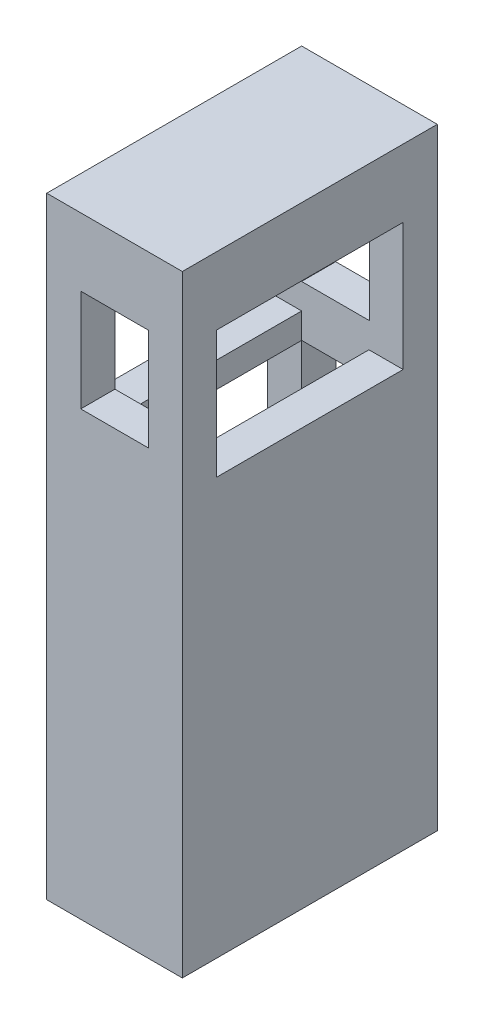
ISO-10303-21;
HEADER;
FILE_DESCRIPTION(('STEP AP214'),'2;1');
FILE_NAME('part.step','',(''),(''),'','','');
FILE_SCHEMA(('AUTOMOTIVE_DESIGN { 1 0 10303 214 1 1 1 1 }'));
ENDSEC;
DATA;
#1=APPLICATION_CONTEXT('core data for automotive mechanical design processes');
#2=APPLICATION_PROTOCOL_DEFINITION('international standard','automotive_design',2000,#1);
#3=PRODUCT_CONTEXT('',#1,'mechanical');
#4=PRODUCT('Part','Part','',(#3));
#5=PRODUCT_RELATED_PRODUCT_CATEGORY('part','',(#4));
#6=PRODUCT_DEFINITION_FORMATION('','',#4);
#7=PRODUCT_DEFINITION_CONTEXT('part definition',#1,'design');
#8=PRODUCT_DEFINITION('design','',#6,#7);
#9=PRODUCT_DEFINITION_SHAPE('','',#8);
#10=(LENGTH_UNIT() NAMED_UNIT(*) SI_UNIT(.MILLI.,.METRE.));
#11=(NAMED_UNIT(*) PLANE_ANGLE_UNIT() SI_UNIT($,.RADIAN.));
#12=(NAMED_UNIT(*) SI_UNIT($,.STERADIAN.) SOLID_ANGLE_UNIT());
#13=UNCERTAINTY_MEASURE_WITH_UNIT(LENGTH_MEASURE(1.E-05),#10,'distance_accuracy_value','');
#14=(GEOMETRIC_REPRESENTATION_CONTEXT(3) GLOBAL_UNCERTAINTY_ASSIGNED_CONTEXT((#13)) GLOBAL_UNIT_ASSIGNED_CONTEXT((#10,
#11,#12)) REPRESENTATION_CONTEXT('',''));
#15=CARTESIAN_POINT('',(0.,0.,0.));
#16=DIRECTION('',(0.,0.,1.));
#17=DIRECTION('',(1.,0.,0.));
#18=AXIS2_PLACEMENT_3D('',#15,#16,#17);
#19=CARTESIAN_POINT('',(667.5,10670.,0.));
#20=DIRECTION('',(0.,1.,0.));
#21=DIRECTION('',(0.,0.,1.));
#22=AXIS2_PLACEMENT_3D('',#19,#20,#21);
#23=PLANE('',#22);
#24=DIRECTION('',(1.,0.,0.));
#25=VECTOR('',#24,1.);
#26=CARTESIAN_POINT('',(0.,10670.,670.000000000001));
#27=LINE('',#26,#25);
#28=CARTESIAN_POINT('',(0.,10670.,670.000000000001));
#29=VERTEX_POINT('',#28);
#30=CARTESIAN_POINT('',(200.,10670.,670.000000000001));
#31=VERTEX_POINT('',#30);
#32=EDGE_CURVE('E403',#29,#31,#27,.T.);
#33=ORIENTED_EDGE('',*,*,#32,.T.);
#34=DIRECTION('',(0.,0.,-1.));
#35=VECTOR('',#34,1.);
#36=CARTESIAN_POINT('',(200.,10670.,4330.));
#37=LINE('',#36,#35);
#38=CARTESIAN_POINT('',(200.,10670.,4330.));
#39=VERTEX_POINT('',#38);
#40=EDGE_CURVE('E281',#39,#31,#37,.T.);
#41=ORIENTED_EDGE('',*,*,#40,.F.);
#42=DIRECTION('',(1.,0.,0.));
#43=VECTOR('',#42,1.);
#44=CARTESIAN_POINT('',(0.,10670.,4330.));
#45=LINE('',#44,#43);
#46=CARTESIAN_POINT('',(0.,10670.,4330.));
#47=VERTEX_POINT('',#46);
#48=EDGE_CURVE('E399',#47,#39,#45,.T.);
#49=ORIENTED_EDGE('',*,*,#48,.F.);
#50=DIRECTION('',(0.,0.,-1.));
#51=VECTOR('',#50,1.);
#52=CARTESIAN_POINT('',(0.,10670.,4330.));
#53=LINE('',#52,#51);
#54=EDGE_CURVE('E377',#47,#29,#53,.T.);
#55=ORIENTED_EDGE('',*,*,#54,.T.);
#56=EDGE_LOOP('',(#33,#41,#49,#55));
#57=FACE_BOUND('',#56,.T.);
#58=ADVANCED_FACE('F34',(#57),#23,.F.);
#59=DIRECTION('',(0.,0.,1.));
#60=VECTOR('',#59,1.);
#61=CARTESIAN_POINT('',(667.5,10670.,0.));
#62=LINE('',#61,#60);
#63=CARTESIAN_POINT('',(667.5,10670.,4330.));
#64=VERTEX_POINT('',#63);
#65=CARTESIAN_POINT('',(667.5,10670.,5000.));
#66=VERTEX_POINT('',#65);
#67=EDGE_CURVE('E449',#64,#66,#62,.T.);
#68=ORIENTED_EDGE('',*,*,#67,.F.);
#69=DIRECTION('',(-1.,0.,0.));
#70=VECTOR('',#69,1.);
#71=CARTESIAN_POINT('',(200.,10670.,4330.));
#72=LINE('',#71,#70);
#73=CARTESIAN_POINT('',(1997.5,10670.,4330.));
#74=VERTEX_POINT('',#73);
#75=EDGE_CURVE('E289',#74,#64,#72,.T.);
#76=ORIENTED_EDGE('',*,*,#75,.F.);
#77=DIRECTION('',(0.,0.,1.));
#78=VECTOR('',#77,1.);
#79=CARTESIAN_POINT('',(1997.5,10670.,0.));
#80=LINE('',#79,#78);
#81=CARTESIAN_POINT('',(1997.5,10670.,5000.));
#82=VERTEX_POINT('',#81);
#83=EDGE_CURVE('E453',#74,#82,#80,.T.);
#84=ORIENTED_EDGE('',*,*,#83,.T.);
#85=DIRECTION('',(-1.,0.,0.));
#86=VECTOR('',#85,1.);
#87=CARTESIAN_POINT('',(667.5,10670.,5000.));
#88=LINE('',#87,#86);
#89=EDGE_CURVE('E425',#82,#66,#88,.T.);
#90=ORIENTED_EDGE('',*,*,#89,.T.);
#91=EDGE_LOOP('',(#68,#76,#84,#90));
#92=FACE_BOUND('',#91,.T.);
#93=ADVANCED_FACE('F514',(#92),#23,.F.);
#94=CARTESIAN_POINT('',(2460.,10670.,4330.));
#95=VERTEX_POINT('',#94);
#96=CARTESIAN_POINT('',(2660.,10670.,4330.));
#97=VERTEX_POINT('',#96);
#98=EDGE_CURVE('E402',#95,#97,#45,.T.);
#99=ORIENTED_EDGE('',*,*,#98,.F.);
#100=DIRECTION('',(0.,0.,1.));
#101=VECTOR('',#100,1.);
#102=CARTESIAN_POINT('',(2460.,10670.,4330.));
#103=LINE('',#102,#101);
#104=CARTESIAN_POINT('',(2460.,10670.,670.000000000001));
#105=VERTEX_POINT('',#104);
#106=EDGE_CURVE('E57',#105,#95,#103,.T.);
#107=ORIENTED_EDGE('',*,*,#106,.F.);
#108=CARTESIAN_POINT('',(2660.,10670.,670.000000000001));
#109=VERTEX_POINT('',#108);
#110=EDGE_CURVE('E406',#105,#109,#27,.T.);
#111=ORIENTED_EDGE('',*,*,#110,.T.);
#112=DIRECTION('',(0.,0.,-1.));
#113=VECTOR('',#112,1.);
#114=CARTESIAN_POINT('',(2660.,10670.,4330.));
#115=LINE('',#114,#113);
#116=EDGE_CURVE('E389',#97,#109,#115,.T.);
#117=ORIENTED_EDGE('',*,*,#116,.F.);
#118=EDGE_LOOP('',(#99,#107,#111,#117));
#119=FACE_BOUND('',#118,.T.);
#120=ADVANCED_FACE('F516',(#119),#23,.F.);
#121=CARTESIAN_POINT('',(670.,5510.,4330.));
#122=DIRECTION('',(-1.,0.,0.));
#123=DIRECTION('',(0.,0.,1.));
#124=AXIS2_PLACEMENT_3D('',#121,#122,#123);
#125=PLANE('',#124);
#126=DIRECTION('',(0.,1.,0.));
#127=VECTOR('',#126,1.);
#128=CARTESIAN_POINT('',(670.,5010.,670.));
#129=LINE('',#128,#127);
#130=CARTESIAN_POINT('',(670.,5010.,670.));
#131=VERTEX_POINT('',#130);
#132=CARTESIAN_POINT('',(670.,7670.,670.));
#133=VERTEX_POINT('',#132);
#134=EDGE_CURVE('E316',#131,#133,#129,.T.);
#135=ORIENTED_EDGE('',*,*,#134,.F.);
#136=DIRECTION('',(0.,0.,-1.));
#137=VECTOR('',#136,1.);
#138=CARTESIAN_POINT('',(670.,5010.,4268.99999999999));
#139=LINE('',#138,#137);
#140=CARTESIAN_POINT('',(670.,5010.,0.));
#141=VERTEX_POINT('',#140);
#142=EDGE_CURVE('E331',#131,#141,#139,.T.);
#143=ORIENTED_EDGE('',*,*,#142,.T.);
#144=DIRECTION('',(0.,1.,0.));
#145=VECTOR('',#144,1.);
#146=CARTESIAN_POINT('',(670.,7670.,0.));
#147=LINE('',#146,#145);
#148=CARTESIAN_POINT('',(670.,7670.,0.));
#149=VERTEX_POINT('',#148);
#150=EDGE_CURVE('E337',#141,#149,#147,.T.);
#151=ORIENTED_EDGE('',*,*,#150,.T.);
#152=DIRECTION('',(0.,0.,1.));
#153=VECTOR('',#152,1.);
#154=CARTESIAN_POINT('',(670.,7670.,4268.99999999999));
#155=LINE('',#154,#153);
#156=EDGE_CURVE('E339',#149,#133,#155,.T.);
#157=ORIENTED_EDGE('',*,*,#156,.T.);
#158=EDGE_LOOP('',(#135,#143,#151,#157));
#159=FACE_BOUND('',#158,.T.);
#160=ADVANCED_FACE('F522',(#159),#125,.F.);
#161=CARTESIAN_POINT('',(1990.,5010.,-1.2E-05));
#162=DIRECTION('',(0.,1.,0.));
#163=DIRECTION('',(0.,0.,1.));
#164=AXIS2_PLACEMENT_3D('',#161,#162,#163);
#165=PLANE('',#164);
#166=ORIENTED_EDGE('',*,*,#142,.F.);
#167=DIRECTION('',(-1.,0.,0.));
#168=VECTOR('',#167,1.);
#169=CARTESIAN_POINT('',(670.,5010.,670.));
#170=LINE('',#169,#168);
#171=CARTESIAN_POINT('',(0.,5010.,670.));
#172=VERTEX_POINT('',#171);
#173=EDGE_CURVE('E332',#131,#172,#170,.T.);
#174=ORIENTED_EDGE('',*,*,#173,.T.);
#175=DIRECTION('',(0.,0.,-1.));
#176=VECTOR('',#175,1.);
#177=CARTESIAN_POINT('',(0.,5010.,4330.));
#178=LINE('',#177,#176);
#179=CARTESIAN_POINT('',(0.,5010.,4330.));
#180=VERTEX_POINT('',#179);
#181=EDGE_CURVE('E324',#180,#172,#178,.T.);
#182=ORIENTED_EDGE('',*,*,#181,.F.);
#183=DIRECTION('',(-1.,0.,0.));
#184=VECTOR('',#183,1.);
#185=CARTESIAN_POINT('',(1990.,5010.,4330.));
#186=LINE('',#185,#184);
#187=CARTESIAN_POINT('',(1990.,5010.,4330.));
#188=VERTEX_POINT('',#187);
#189=EDGE_CURVE('E342',#188,#180,#186,.T.);
#190=ORIENTED_EDGE('',*,*,#189,.F.);
#191=DIRECTION('',(0.,0.,1.));
#192=VECTOR('',#191,1.);
#193=CARTESIAN_POINT('',(1990.,5010.,-1.2E-05));
#194=LINE('',#193,#192);
#195=CARTESIAN_POINT('',(1990.,5010.,0.));
#196=VERTEX_POINT('',#195);
#197=EDGE_CURVE('E346',#196,#188,#194,.T.);
#198=ORIENTED_EDGE('',*,*,#197,.F.);
#199=DIRECTION('',(-1.,0.,0.));
#200=VECTOR('',#199,1.);
#201=CARTESIAN_POINT('',(0.,5010.,0.));
#202=LINE('',#201,#200);
#203=EDGE_CURVE('E11',#196,#141,#202,.T.);
#204=ORIENTED_EDGE('',*,*,#203,.T.);
#205=EDGE_LOOP('',(#166,#174,#182,#190,#198,#204));
#206=FACE_BOUND('',#205,.T.);
#207=ADVANCED_FACE('F548',(#206),#165,.T.);
#208=CARTESIAN_POINT('',(0.,0.,0.));
#209=DIRECTION('',(0.,0.,1.));
#210=DIRECTION('',(1.,0.,0.));
#211=AXIS2_PLACEMENT_3D('',#208,#209,#210);
#212=PLANE('',#211);
#213=DIRECTION('',(1.,0.,0.));
#214=VECTOR('',#213,1.);
#215=CARTESIAN_POINT('',(0.,12000.,0.));
#216=LINE('',#215,#214);
#217=CARTESIAN_POINT('',(0.,12000.,0.));
#218=VERTEX_POINT('',#217);
#219=CARTESIAN_POINT('',(2660.,12000.,0.));
#220=VERTEX_POINT('',#219);
#221=EDGE_CURVE('E448',#218,#220,#216,.T.);
#222=ORIENTED_EDGE('',*,*,#221,.T.);
#223=DIRECTION('',(0.,1.,0.));
#224=VECTOR('',#223,1.);
#225=CARTESIAN_POINT('',(2660.,0.,0.));
#226=LINE('',#225,#224);
#227=CARTESIAN_POINT('',(2660.,0.,0.));
#228=VERTEX_POINT('',#227);
#229=EDGE_CURVE('E475',#228,#220,#226,.T.);
#230=ORIENTED_EDGE('',*,*,#229,.F.);
#231=DIRECTION('',(1.,0.,0.));
#232=VECTOR('',#231,1.);
#233=CARTESIAN_POINT('',(0.,0.,0.));
#234=LINE('',#233,#232);
#235=CARTESIAN_POINT('',(0.,0.,0.));
#236=VERTEX_POINT('',#235);
#237=EDGE_CURVE('E478',#236,#228,#234,.T.);
#238=ORIENTED_EDGE('',*,*,#237,.F.);
#239=DIRECTION('',(0.,1.,0.));
#240=VECTOR('',#239,1.);
#241=CARTESIAN_POINT('',(0.,0.,0.));
#242=LINE('',#241,#240);
#243=EDGE_CURVE('E465',#236,#218,#242,.T.);
#244=ORIENTED_EDGE('',*,*,#243,.T.);
#245=EDGE_LOOP('',(#222,#230,#238,#244));
#246=FACE_BOUND('',#245,.T.);
#247=DIRECTION('',(-1.,0.,0.));
#248=VECTOR('',#247,1.);
#249=CARTESIAN_POINT('',(667.5,10670.,0.));
#250=LINE('',#249,#248);
#251=CARTESIAN_POINT('',(1997.5,10670.,0.));
#252=VERTEX_POINT('',#251);
#253=CARTESIAN_POINT('',(667.5,10670.,0.));
#254=VERTEX_POINT('',#253);
#255=EDGE_CURVE('E431',#252,#254,#250,.T.);
#256=ORIENTED_EDGE('',*,*,#255,.T.);
#257=DIRECTION('',(0.,-1.,0.));
#258=VECTOR('',#257,1.);
#259=CARTESIAN_POINT('',(667.5,10670.,0.));
#260=LINE('',#259,#258);
#261=CARTESIAN_POINT('',(667.5,8670.,0.));
#262=VERTEX_POINT('',#261);
#263=EDGE_CURVE('E421',#254,#262,#260,.T.);
#264=ORIENTED_EDGE('',*,*,#263,.T.);
#265=DIRECTION('',(1.,0.,0.));
#266=VECTOR('',#265,1.);
#267=CARTESIAN_POINT('',(667.5,8670.,0.));
#268=LINE('',#267,#266);
#269=CARTESIAN_POINT('',(1997.5,8670.,0.));
#270=VERTEX_POINT('',#269);
#271=EDGE_CURVE('E424',#262,#270,#268,.T.);
#272=ORIENTED_EDGE('',*,*,#271,.T.);
#273=DIRECTION('',(0.,1.,0.));
#274=VECTOR('',#273,1.);
#275=CARTESIAN_POINT('',(1997.5,10670.,0.));
#276=LINE('',#275,#274);
#277=EDGE_CURVE('E428',#270,#252,#276,.T.);
#278=ORIENTED_EDGE('',*,*,#277,.T.);
#279=EDGE_LOOP('',(#256,#264,#272,#278));
#280=FACE_BOUND('',#279,.T.);
#281=DIRECTION('',(0.,-1.,0.));
#282=VECTOR('',#281,1.);
#283=CARTESIAN_POINT('',(1990.,-1.66116076616847E-13,0.));
#284=LINE('',#283,#282);
#285=CARTESIAN_POINT('',(1990.,7670.,0.));
#286=VERTEX_POINT('',#285);
#287=EDGE_CURVE('E349',#286,#196,#284,.T.);
#288=ORIENTED_EDGE('',*,*,#287,.F.);
#289=DIRECTION('',(1.,0.,0.));
#290=VECTOR('',#289,1.);
#291=CARTESIAN_POINT('',(0.,7670.,0.));
#292=LINE('',#291,#290);
#293=EDGE_CURVE('E354',#149,#286,#292,.T.);
#294=ORIENTED_EDGE('',*,*,#293,.F.);
#295=ORIENTED_EDGE('',*,*,#150,.F.);
#296=ORIENTED_EDGE('',*,*,#203,.F.);
#297=EDGE_LOOP('',(#288,#294,#295,#296));
#298=FACE_BOUND('',#297,.T.);
#299=ADVANCED_FACE('F544',(#246,#280,#298),#212,.F.);
#300=CARTESIAN_POINT('',(0.,10670.,670.000000000001));
#301=DIRECTION('',(0.,0.,1.));
#302=DIRECTION('',(0.,-1.,0.));
#303=AXIS2_PLACEMENT_3D('',#300,#301,#302);
#304=PLANE('',#303);
#305=ORIENTED_EDGE('',*,*,#110,.F.);
#306=DIRECTION('',(0.,-1.,0.));
#307=VECTOR('',#306,1.);
#308=CARTESIAN_POINT('',(2460.,11670.,670.000000000001));
#309=LINE('',#308,#307);
#310=CARTESIAN_POINT('',(2460.,11670.,670.000000000001));
#311=VERTEX_POINT('',#310);
#312=EDGE_CURVE('E310',#311,#105,#309,.T.);
#313=ORIENTED_EDGE('',*,*,#312,.F.);
#314=DIRECTION('',(1.,0.,0.));
#315=VECTOR('',#314,1.);
#316=CARTESIAN_POINT('',(200.,11670.,670.000000000001));
#317=LINE('',#316,#315);
#318=CARTESIAN_POINT('',(200.,11670.,670.000000000001));
#319=VERTEX_POINT('',#318);
#320=EDGE_CURVE('E288',#319,#311,#317,.T.);
#321=ORIENTED_EDGE('',*,*,#320,.F.);
#322=DIRECTION('',(0.,-1.,0.));
#323=VECTOR('',#322,1.);
#324=CARTESIAN_POINT('',(200.,11670.,670.000000000001));
#325=LINE('',#324,#323);
#326=EDGE_CURVE('E298',#319,#31,#325,.T.);
#327=ORIENTED_EDGE('',*,*,#326,.T.);
#328=ORIENTED_EDGE('',*,*,#32,.F.);
#329=DIRECTION('',(0.,-1.,0.));
#330=VECTOR('',#329,1.);
#331=CARTESIAN_POINT('',(0.,10670.,670.000000000001));
#332=LINE('',#331,#330);
#333=CARTESIAN_POINT('',(0.,8170.,670.));
#334=VERTEX_POINT('',#333);
#335=EDGE_CURVE('E374',#29,#334,#332,.T.);
#336=ORIENTED_EDGE('',*,*,#335,.T.);
#337=DIRECTION('',(1.,0.,0.));
#338=VECTOR('',#337,1.);
#339=CARTESIAN_POINT('',(0.,8170.,670.));
#340=LINE('',#339,#338);
#341=CARTESIAN_POINT('',(670.,8170.,670.));
#342=VERTEX_POINT('',#341);
#343=EDGE_CURVE('E407',#334,#342,#340,.T.);
#344=ORIENTED_EDGE('',*,*,#343,.T.);
#345=DIRECTION('',(0.,1.,0.));
#346=VECTOR('',#345,1.);
#347=CARTESIAN_POINT('',(670.,5510.,670.));
#348=LINE('',#347,#346);
#349=EDGE_CURVE('E368',#133,#342,#348,.T.);
#350=ORIENTED_EDGE('',*,*,#349,.F.);
#351=DIRECTION('',(1.,0.,0.));
#352=VECTOR('',#351,1.);
#353=CARTESIAN_POINT('',(0.,7670.,670.));
#354=LINE('',#353,#352);
#355=CARTESIAN_POINT('',(1990.,7670.,670.));
#356=VERTEX_POINT('',#355);
#357=EDGE_CURVE('E351',#133,#356,#354,.T.);
#358=ORIENTED_EDGE('',*,*,#357,.T.);
#359=DIRECTION('',(0.,1.,0.));
#360=VECTOR('',#359,1.);
#361=CARTESIAN_POINT('',(1990.,5510.,670.));
#362=LINE('',#361,#360);
#363=CARTESIAN_POINT('',(1990.,8170.,670.));
#364=VERTEX_POINT('',#363);
#365=EDGE_CURVE('E362',#356,#364,#362,.T.);
#366=ORIENTED_EDGE('',*,*,#365,.T.);
#367=CARTESIAN_POINT('',(2660.,8170.,670.));
#368=VERTEX_POINT('',#367);
#369=EDGE_CURVE('E383',#364,#368,#340,.T.);
#370=ORIENTED_EDGE('',*,*,#369,.T.);
#371=DIRECTION('',(0.,-1.,0.));
#372=VECTOR('',#371,1.);
#373=CARTESIAN_POINT('',(2660.,10670.,670.000000000001));
#374=LINE('',#373,#372);
#375=EDGE_CURVE('E386',#109,#368,#374,.T.);
#376=ORIENTED_EDGE('',*,*,#375,.F.);
#377=EDGE_LOOP('',(#305,#313,#321,#327,#328,#336,#344,#350,#358,#366,#370,#376));
#378=FACE_BOUND('',#377,.T.);
#379=DIRECTION('',(1.,0.,0.));
#380=VECTOR('',#379,1.);
#381=CARTESIAN_POINT('',(200.,10670.,670.000000000001));
#382=LINE('',#381,#380);
#383=CARTESIAN_POINT('',(667.5,10670.,670.000000000001));
#384=VERTEX_POINT('',#383);
#385=CARTESIAN_POINT('',(1997.5,10670.,670.000000000001));
#386=VERTEX_POINT('',#385);
#387=EDGE_CURVE('E301',#384,#386,#382,.T.);
#388=ORIENTED_EDGE('',*,*,#387,.T.);
#389=DIRECTION('',(0.,-1.,0.));
#390=VECTOR('',#389,1.);
#391=CARTESIAN_POINT('',(1997.5,10670.,670.000000000001));
#392=LINE('',#391,#390);
#393=CARTESIAN_POINT('',(1997.5,8670.,670.));
#394=VERTEX_POINT('',#393);
#395=EDGE_CURVE('E397',#386,#394,#392,.T.);
#396=ORIENTED_EDGE('',*,*,#395,.T.);
#397=DIRECTION('',(-1.,0.,0.));
#398=VECTOR('',#397,1.);
#399=CARTESIAN_POINT('',(667.5,8670.,670.));
#400=LINE('',#399,#398);
#401=CARTESIAN_POINT('',(667.5,8670.,670.));
#402=VERTEX_POINT('',#401);
#403=EDGE_CURVE('E484',#394,#402,#400,.T.);
#404=ORIENTED_EDGE('',*,*,#403,.T.);
#405=DIRECTION('',(0.,1.,0.));
#406=VECTOR('',#405,1.);
#407=CARTESIAN_POINT('',(667.5,10670.,670.000000000001));
#408=LINE('',#407,#406);
#409=EDGE_CURVE('E411',#402,#384,#408,.T.);
#410=ORIENTED_EDGE('',*,*,#409,.T.);
#411=EDGE_LOOP('',(#388,#396,#404,#410));
#412=FACE_BOUND('',#411,.T.);
#413=ADVANCED_FACE('F547',(#378,#412),#304,.T.);
#414=DIRECTION('',(0.,1.,0.));
#415=VECTOR('',#414,1.);
#416=CARTESIAN_POINT('',(670.,5510.,4330.));
#417=LINE('',#416,#415);
#418=CARTESIAN_POINT('',(670.,7670.,4330.));
#419=VERTEX_POINT('',#418);
#420=CARTESIAN_POINT('',(670.,8170.,4330.));
#421=VERTEX_POINT('',#420);
#422=EDGE_CURVE('E366',#419,#421,#417,.T.);
#423=ORIENTED_EDGE('',*,*,#422,.F.);
#424=DIRECTION('',(0.,0.,-1.));
#425=VECTOR('',#424,1.);
#426=CARTESIAN_POINT('',(670.,7670.,4330.));
#427=LINE('',#426,#425);
#428=EDGE_CURVE('E313',#419,#133,#427,.T.);
#429=ORIENTED_EDGE('',*,*,#428,.T.);
#430=ORIENTED_EDGE('',*,*,#349,.T.);
#431=DIRECTION('',(0.,0.,1.));
#432=VECTOR('',#431,1.);
#433=CARTESIAN_POINT('',(670.,8170.,4330.));
#434=LINE('',#433,#432);
#435=EDGE_CURVE('E359',#342,#421,#434,.T.);
#436=ORIENTED_EDGE('',*,*,#435,.T.);
#437=EDGE_LOOP('',(#423,#429,#430,#436));
#438=FACE_BOUND('',#437,.T.);
#439=ADVANCED_FACE('F599',(#438),#125,.F.);
#440=CARTESIAN_POINT('',(0.,8170.,4330.));
#441=DIRECTION('',(0.,-1.,0.));
#442=DIRECTION('',(0.,0.,-1.));
#443=AXIS2_PLACEMENT_3D('',#440,#441,#442);
#444=PLANE('',#443);
#445=ORIENTED_EDGE('',*,*,#369,.F.);
#446=DIRECTION('',(0.,0.,-1.));
#447=VECTOR('',#446,1.);
#448=CARTESIAN_POINT('',(1990.,8170.,4330.));
#449=LINE('',#448,#447);
#450=CARTESIAN_POINT('',(1990.,8170.,4330.));
#451=VERTEX_POINT('',#450);
#452=EDGE_CURVE('E356',#451,#364,#449,.T.);
#453=ORIENTED_EDGE('',*,*,#452,.F.);
#454=DIRECTION('',(1.,0.,0.));
#455=VECTOR('',#454,1.);
#456=CARTESIAN_POINT('',(0.,8170.,4330.));
#457=LINE('',#456,#455);
#458=CARTESIAN_POINT('',(2660.,8170.,4330.));
#459=VERTEX_POINT('',#458);
#460=EDGE_CURVE('E398',#451,#459,#457,.T.);
#461=ORIENTED_EDGE('',*,*,#460,.T.);
#462=DIRECTION('',(0.,0.,-1.));
#463=VECTOR('',#462,1.);
#464=CARTESIAN_POINT('',(2660.,8170.,4330.));
#465=LINE('',#464,#463);
#466=EDGE_CURVE('E365',#459,#368,#465,.T.);
#467=ORIENTED_EDGE('',*,*,#466,.T.);
#468=EDGE_LOOP('',(#445,#453,#461,#467));
#469=FACE_BOUND('',#468,.T.);
#470=ADVANCED_FACE('F604',(#469),#444,.F.);
#471=CARTESIAN_POINT('',(667.5,10670.,0.));
#472=DIRECTION('',(-1.,0.,0.));
#473=DIRECTION('',(0.,-1.,0.));
#474=AXIS2_PLACEMENT_3D('',#471,#472,#473);
#475=PLANE('',#474);
#476=ORIENTED_EDGE('',*,*,#409,.F.);
#477=DIRECTION('',(0.,0.,1.));
#478=VECTOR('',#477,1.);
#479=CARTESIAN_POINT('',(667.5,8670.,0.));
#480=LINE('',#479,#478);
#481=EDGE_CURVE('E458',#262,#402,#480,.T.);
#482=ORIENTED_EDGE('',*,*,#481,.F.);
#483=ORIENTED_EDGE('',*,*,#263,.F.);
#484=EDGE_CURVE('E445',#254,#384,#62,.T.);
#485=ORIENTED_EDGE('',*,*,#484,.T.);
#486=EDGE_LOOP('',(#476,#482,#483,#485));
#487=FACE_BOUND('',#486,.T.);
#488=ADVANCED_FACE('F540',(#487),#475,.F.);
#489=CARTESIAN_POINT('',(1997.5,10670.,0.));
#490=DIRECTION('',(1.,0.,0.));
#491=DIRECTION('',(0.,1.,0.));
#492=AXIS2_PLACEMENT_3D('',#489,#490,#491);
#493=PLANE('',#492);
#494=ORIENTED_EDGE('',*,*,#395,.F.);
#495=EDGE_CURVE('E450',#252,#386,#80,.T.);
#496=ORIENTED_EDGE('',*,*,#495,.F.);
#497=ORIENTED_EDGE('',*,*,#277,.F.);
#498=DIRECTION('',(0.,0.,1.));
#499=VECTOR('',#498,1.);
#500=CARTESIAN_POINT('',(1997.5,8670.,0.));
#501=LINE('',#500,#499);
#502=EDGE_CURVE('E454',#270,#394,#501,.T.);
#503=ORIENTED_EDGE('',*,*,#502,.T.);
#504=EDGE_LOOP('',(#494,#496,#497,#503));
#505=FACE_BOUND('',#504,.T.);
#506=ADVANCED_FACE('F534',(#505),#493,.F.);
#507=CARTESIAN_POINT('',(667.5,8670.,0.));
#508=DIRECTION('',(0.,-1.,0.));
#509=DIRECTION('',(0.,0.,-1.));
#510=AXIS2_PLACEMENT_3D('',#507,#508,#509);
#511=PLANE('',#510);
#512=ORIENTED_EDGE('',*,*,#403,.F.);
#513=ORIENTED_EDGE('',*,*,#502,.F.);
#514=ORIENTED_EDGE('',*,*,#271,.F.);
#515=ORIENTED_EDGE('',*,*,#481,.T.);
#516=EDGE_LOOP('',(#512,#513,#514,#515));
#517=FACE_BOUND('',#516,.T.);
#518=ADVANCED_FACE('F537',(#517),#511,.F.);
#519=CARTESIAN_POINT('',(0.,12000.,5000.));
#520=DIRECTION('',(0.,1.,0.));
#521=DIRECTION('',(0.,0.,1.));
#522=AXIS2_PLACEMENT_3D('',#519,#520,#521);
#523=PLANE('',#522);
#524=ORIENTED_EDGE('',*,*,#221,.F.);
#525=DIRECTION('',(0.,0.,-1.));
#526=VECTOR('',#525,1.);
#527=CARTESIAN_POINT('',(0.,12000.,5000.));
#528=LINE('',#527,#526);
#529=CARTESIAN_POINT('',(0.,12000.,5000.));
#530=VERTEX_POINT('',#529);
#531=EDGE_CURVE('E482',#530,#218,#528,.T.);
#532=ORIENTED_EDGE('',*,*,#531,.F.);
#533=DIRECTION('',(1.,0.,0.));
#534=VECTOR('',#533,1.);
#535=CARTESIAN_POINT('',(0.,12000.,5000.));
#536=LINE('',#535,#534);
#537=CARTESIAN_POINT('',(2660.,12000.,5000.));
#538=VERTEX_POINT('',#537);
#539=EDGE_CURVE('E461',#530,#538,#536,.T.);
#540=ORIENTED_EDGE('',*,*,#539,.T.);
#541=DIRECTION('',(0.,0.,-1.));
#542=VECTOR('',#541,1.);
#543=CARTESIAN_POINT('',(2660.,12000.,5000.));
#544=LINE('',#543,#542);
#545=EDGE_CURVE('E472',#538,#220,#544,.T.);
#546=ORIENTED_EDGE('',*,*,#545,.T.);
#547=EDGE_LOOP('',(#524,#532,#540,#546));
#548=FACE_BOUND('',#547,.T.);
#549=ADVANCED_FACE('F36',(#548),#523,.T.);
#550=CARTESIAN_POINT('',(0.,0.,5000.));
#551=DIRECTION('',(-1.,0.,0.));
#552=DIRECTION('',(0.,0.,1.));
#553=AXIS2_PLACEMENT_3D('',#550,#551,#552);
#554=PLANE('',#553);
#555=DIRECTION('',(0.,0.,-1.));
#556=VECTOR('',#555,1.);
#557=CARTESIAN_POINT('',(0.,7670.,4330.));
#558=LINE('',#557,#556);
#559=CARTESIAN_POINT('',(0.,7670.,4330.));
#560=VERTEX_POINT('',#559);
#561=CARTESIAN_POINT('',(0.,7670.,670.));
#562=VERTEX_POINT('',#561);
#563=EDGE_CURVE('E307',#560,#562,#558,.T.);
#564=ORIENTED_EDGE('',*,*,#563,.F.);
#565=DIRECTION('',(0.,1.,0.));
#566=VECTOR('',#565,1.);
#567=CARTESIAN_POINT('',(0.,5010.,4330.));
#568=LINE('',#567,#566);
#569=EDGE_CURVE('E317',#180,#560,#568,.T.);
#570=ORIENTED_EDGE('',*,*,#569,.F.);
#571=ORIENTED_EDGE('',*,*,#181,.T.);
#572=DIRECTION('',(0.,1.,0.));
#573=VECTOR('',#572,1.);
#574=CARTESIAN_POINT('',(0.,5010.,670.));
#575=LINE('',#574,#573);
#576=EDGE_CURVE('E321',#172,#562,#575,.T.);
#577=ORIENTED_EDGE('',*,*,#576,.T.);
#578=EDGE_LOOP('',(#564,#570,#571,#577));
#579=FACE_BOUND('',#578,.T.);
#580=DIRECTION('',(0.,0.,-1.));
#581=VECTOR('',#580,1.);
#582=CARTESIAN_POINT('',(0.,8170.,4330.));
#583=LINE('',#582,#581);
#584=CARTESIAN_POINT('',(0.,8170.,4330.));
#585=VERTEX_POINT('',#584);
#586=EDGE_CURVE('E371',#585,#334,#583,.T.);
#587=ORIENTED_EDGE('',*,*,#586,.T.);
#588=ORIENTED_EDGE('',*,*,#335,.F.);
#589=ORIENTED_EDGE('',*,*,#54,.F.);
#590=DIRECTION('',(0.,-1.,0.));
#591=VECTOR('',#590,1.);
#592=CARTESIAN_POINT('',(0.,10670.,4330.));
#593=LINE('',#592,#591);
#594=EDGE_CURVE('E380',#47,#585,#593,.T.);
#595=ORIENTED_EDGE('',*,*,#594,.T.);
#596=EDGE_LOOP('',(#587,#588,#589,#595));
#597=FACE_BOUND('',#596,.T.);
#598=ORIENTED_EDGE('',*,*,#243,.F.);
#599=DIRECTION('',(0.,0.,-1.));
#600=VECTOR('',#599,1.);
#601=CARTESIAN_POINT('',(0.,0.,5000.));
#602=LINE('',#601,#600);
#603=CARTESIAN_POINT('',(0.,0.,5000.));
#604=VERTEX_POINT('',#603);
#605=EDGE_CURVE('E485',#604,#236,#602,.T.);
#606=ORIENTED_EDGE('',*,*,#605,.F.);
#607=DIRECTION('',(0.,1.,0.));
#608=VECTOR('',#607,1.);
#609=CARTESIAN_POINT('',(0.,0.,5000.));
#610=LINE('',#609,#608);
#611=EDGE_CURVE('E469',#604,#530,#610,.T.);
#612=ORIENTED_EDGE('',*,*,#611,.T.);
#613=ORIENTED_EDGE('',*,*,#531,.T.);
#614=EDGE_LOOP('',(#598,#606,#612,#613));
#615=FACE_BOUND('',#614,.T.);
#616=ADVANCED_FACE('F550',(#579,#597,#615),#554,.T.);
#617=CARTESIAN_POINT('',(0.,0.,5000.));
#618=DIRECTION('',(0.,1.,0.));
#619=DIRECTION('',(0.,0.,1.));
#620=AXIS2_PLACEMENT_3D('',#617,#618,#619);
#621=PLANE('',#620);
#622=DIRECTION('',(-1.,0.,0.));
#623=VECTOR('',#622,1.);
#624=CARTESIAN_POINT('',(2160.,0.,4500.));
#625=LINE('',#624,#623);
#626=CARTESIAN_POINT('',(2160.,0.,4500.));
#627=VERTEX_POINT('',#626);
#628=CARTESIAN_POINT('',(500.,0.,4500.));
#629=VERTEX_POINT('',#628);
#630=EDGE_CURVE('E275',#627,#629,#625,.T.);
#631=ORIENTED_EDGE('',*,*,#630,.F.);
#632=DIRECTION('',(0.,0.,1.));
#633=VECTOR('',#632,1.);
#634=CARTESIAN_POINT('',(2160.,0.,4500.));
#635=LINE('',#634,#633);
#636=CARTESIAN_POINT('',(2160.,0.,500.));
#637=VERTEX_POINT('',#636);
#638=EDGE_CURVE('E49',#637,#627,#635,.T.);
#639=ORIENTED_EDGE('',*,*,#638,.F.);
#640=DIRECTION('',(1.,0.,0.));
#641=VECTOR('',#640,1.);
#642=CARTESIAN_POINT('',(2160.,0.,500.));
#643=LINE('',#642,#641);
#644=CARTESIAN_POINT('',(500.,0.,500.));
#645=VERTEX_POINT('',#644);
#646=EDGE_CURVE('E266',#645,#637,#643,.T.);
#647=ORIENTED_EDGE('',*,*,#646,.F.);
#648=DIRECTION('',(0.,0.,-1.));
#649=VECTOR('',#648,1.);
#650=CARTESIAN_POINT('',(500.,0.,4500.));
#651=LINE('',#650,#649);
#652=EDGE_CURVE('E269',#629,#645,#651,.T.);
#653=ORIENTED_EDGE('',*,*,#652,.F.);
#654=EDGE_LOOP('',(#631,#639,#647,#653));
#655=FACE_BOUND('',#654,.T.);
#656=ORIENTED_EDGE('',*,*,#237,.T.);
#657=DIRECTION('',(0.,0.,-1.));
#658=VECTOR('',#657,1.);
#659=CARTESIAN_POINT('',(2660.,0.,5000.));
#660=LINE('',#659,#658);
#661=CARTESIAN_POINT('',(2660.,0.,5000.));
#662=VERTEX_POINT('',#661);
#663=EDGE_CURVE('E487',#662,#228,#660,.T.);
#664=ORIENTED_EDGE('',*,*,#663,.F.);
#665=DIRECTION('',(1.,0.,0.));
#666=VECTOR('',#665,1.);
#667=CARTESIAN_POINT('',(0.,0.,5000.));
#668=LINE('',#667,#666);
#669=EDGE_CURVE('E467',#604,#662,#668,.T.);
#670=ORIENTED_EDGE('',*,*,#669,.F.);
#671=ORIENTED_EDGE('',*,*,#605,.T.);
#672=EDGE_LOOP('',(#656,#664,#670,#671));
#673=FACE_BOUND('',#672,.T.);
#674=ADVANCED_FACE('F553',(#655,#673),#621,.F.);
#675=CARTESIAN_POINT('',(2660.,0.,5000.));
#676=DIRECTION('',(-1.,0.,0.));
#677=DIRECTION('',(0.,0.,1.));
#678=AXIS2_PLACEMENT_3D('',#675,#676,#677);
#679=PLANE('',#678);
#680=ORIENTED_EDGE('',*,*,#375,.T.);
#681=ORIENTED_EDGE('',*,*,#466,.F.);
#682=DIRECTION('',(0.,-1.,0.));
#683=VECTOR('',#682,1.);
#684=CARTESIAN_POINT('',(2660.,10670.,4330.));
#685=LINE('',#684,#683);
#686=EDGE_CURVE('E375',#97,#459,#685,.T.);
#687=ORIENTED_EDGE('',*,*,#686,.F.);
#688=ORIENTED_EDGE('',*,*,#116,.T.);
#689=EDGE_LOOP('',(#680,#681,#687,#688));
#690=FACE_BOUND('',#689,.T.);
#691=ORIENTED_EDGE('',*,*,#229,.T.);
#692=ORIENTED_EDGE('',*,*,#545,.F.);
#693=DIRECTION('',(0.,1.,0.));
#694=VECTOR('',#693,1.);
#695=CARTESIAN_POINT('',(2660.,0.,5000.));
#696=LINE('',#695,#694);
#697=EDGE_CURVE('E464',#662,#538,#696,.T.);
#698=ORIENTED_EDGE('',*,*,#697,.F.);
#699=ORIENTED_EDGE('',*,*,#663,.T.);
#700=EDGE_LOOP('',(#691,#692,#698,#699));
#701=FACE_BOUND('',#700,.T.);
#702=ADVANCED_FACE('F543',(#690,#701),#679,.F.);
#703=CARTESIAN_POINT('',(0.,0.,5000.));
#704=DIRECTION('',(0.,0.,1.));
#705=DIRECTION('',(1.,0.,0.));
#706=AXIS2_PLACEMENT_3D('',#703,#704,#705);
#707=PLANE('',#706);
#708=DIRECTION('',(0.,-1.,0.));
#709=VECTOR('',#708,1.);
#710=CARTESIAN_POINT('',(667.5,10670.,5000.));
#711=LINE('',#710,#709);
#712=CARTESIAN_POINT('',(667.5,8670.,5000.));
#713=VERTEX_POINT('',#712);
#714=EDGE_CURVE('E420',#66,#713,#711,.T.);
#715=ORIENTED_EDGE('',*,*,#714,.F.);
#716=ORIENTED_EDGE('',*,*,#89,.F.);
#717=DIRECTION('',(0.,1.,0.));
#718=VECTOR('',#717,1.);
#719=CARTESIAN_POINT('',(1997.5,10670.,5000.));
#720=LINE('',#719,#718);
#721=CARTESIAN_POINT('',(1997.5,8670.,5000.));
#722=VERTEX_POINT('',#721);
#723=EDGE_CURVE('E440',#722,#82,#720,.T.);
#724=ORIENTED_EDGE('',*,*,#723,.F.);
#725=DIRECTION('',(1.,0.,0.));
#726=VECTOR('',#725,1.);
#727=CARTESIAN_POINT('',(667.5,8670.,5000.));
#728=LINE('',#727,#726);
#729=EDGE_CURVE('E437',#713,#722,#728,.T.);
#730=ORIENTED_EDGE('',*,*,#729,.F.);
#731=EDGE_LOOP('',(#715,#716,#724,#730));
#732=FACE_BOUND('',#731,.T.);
#733=ORIENTED_EDGE('',*,*,#539,.F.);
#734=ORIENTED_EDGE('',*,*,#611,.F.);
#735=ORIENTED_EDGE('',*,*,#669,.T.);
#736=ORIENTED_EDGE('',*,*,#697,.T.);
#737=EDGE_LOOP('',(#733,#734,#735,#736));
#738=FACE_BOUND('',#737,.T.);
#739=ADVANCED_FACE('F506',(#732,#738),#707,.T.);
#740=CARTESIAN_POINT('',(667.5,8670.,4330.));
#741=VERTEX_POINT('',#740);
#742=EDGE_CURVE('E434',#741,#713,#480,.T.);
#743=ORIENTED_EDGE('',*,*,#742,.F.);
#744=DIRECTION('',(0.,1.,0.));
#745=VECTOR('',#744,1.);
#746=CARTESIAN_POINT('',(667.5,10670.,4330.));
#747=LINE('',#746,#745);
#748=EDGE_CURVE('E417',#741,#64,#747,.T.);
#749=ORIENTED_EDGE('',*,*,#748,.T.);
#750=ORIENTED_EDGE('',*,*,#67,.T.);
#751=ORIENTED_EDGE('',*,*,#714,.T.);
#752=EDGE_LOOP('',(#743,#749,#750,#751));
#753=FACE_BOUND('',#752,.T.);
#754=ADVANCED_FACE('F499',(#753),#475,.F.);
#755=ORIENTED_EDGE('',*,*,#495,.T.);
#756=ORIENTED_EDGE('',*,*,#387,.F.);
#757=ORIENTED_EDGE('',*,*,#484,.F.);
#758=ORIENTED_EDGE('',*,*,#255,.F.);
#759=EDGE_LOOP('',(#755,#756,#757,#758));
#760=FACE_BOUND('',#759,.T.);
#761=ADVANCED_FACE('F524',(#760),#23,.F.);
#762=ORIENTED_EDGE('',*,*,#83,.F.);
#763=DIRECTION('',(0.,-1.,0.));
#764=VECTOR('',#763,1.);
#765=CARTESIAN_POINT('',(1997.5,10670.,4330.));
#766=LINE('',#765,#764);
#767=CARTESIAN_POINT('',(1997.5,8670.,4330.));
#768=VERTEX_POINT('',#767);
#769=EDGE_CURVE('E414',#74,#768,#766,.T.);
#770=ORIENTED_EDGE('',*,*,#769,.T.);
#771=EDGE_CURVE('E457',#768,#722,#501,.T.);
#772=ORIENTED_EDGE('',*,*,#771,.T.);
#773=ORIENTED_EDGE('',*,*,#723,.T.);
#774=EDGE_LOOP('',(#762,#770,#772,#773));
#775=FACE_BOUND('',#774,.T.);
#776=ADVANCED_FACE('F510',(#775),#493,.F.);
#777=ORIENTED_EDGE('',*,*,#771,.F.);
#778=DIRECTION('',(-1.,0.,0.));
#779=VECTOR('',#778,1.);
#780=CARTESIAN_POINT('',(667.5,8670.,4330.));
#781=LINE('',#780,#779);
#782=EDGE_CURVE('E42',#768,#741,#781,.T.);
#783=ORIENTED_EDGE('',*,*,#782,.T.);
#784=ORIENTED_EDGE('',*,*,#742,.T.);
#785=ORIENTED_EDGE('',*,*,#729,.T.);
#786=EDGE_LOOP('',(#777,#783,#784,#785));
#787=FACE_BOUND('',#786,.T.);
#788=ADVANCED_FACE('F495',(#787),#511,.F.);
#789=CARTESIAN_POINT('',(0.,10670.,4330.));
#790=DIRECTION('',(0.,0.,1.));
#791=DIRECTION('',(1.,0.,0.));
#792=AXIS2_PLACEMENT_3D('',#789,#790,#791);
#793=PLANE('',#792);
#794=ORIENTED_EDGE('',*,*,#75,.T.);
#795=ORIENTED_EDGE('',*,*,#748,.F.);
#796=ORIENTED_EDGE('',*,*,#782,.F.);
#797=ORIENTED_EDGE('',*,*,#769,.F.);
#798=EDGE_LOOP('',(#794,#795,#796,#797));
#799=FACE_BOUND('',#798,.T.);
#800=ORIENTED_EDGE('',*,*,#189,.T.);
#801=ORIENTED_EDGE('',*,*,#569,.T.);
#802=DIRECTION('',(-1.,0.,0.));
#803=VECTOR('',#802,1.);
#804=CARTESIAN_POINT('',(670.,7670.,4330.));
#805=LINE('',#804,#803);
#806=EDGE_CURVE('E329',#419,#560,#805,.T.);
#807=ORIENTED_EDGE('',*,*,#806,.F.);
#808=ORIENTED_EDGE('',*,*,#422,.T.);
#809=EDGE_CURVE('E394',#585,#421,#457,.T.);
#810=ORIENTED_EDGE('',*,*,#809,.F.);
#811=ORIENTED_EDGE('',*,*,#594,.F.);
#812=ORIENTED_EDGE('',*,*,#48,.T.);
#813=DIRECTION('',(0.,-1.,0.));
#814=VECTOR('',#813,1.);
#815=CARTESIAN_POINT('',(200.,11670.,4330.));
#816=LINE('',#815,#814);
#817=CARTESIAN_POINT('',(200.,11670.,4330.));
#818=VERTEX_POINT('',#817);
#819=EDGE_CURVE('E305',#818,#39,#816,.T.);
#820=ORIENTED_EDGE('',*,*,#819,.F.);
#821=DIRECTION('',(-1.,0.,0.));
#822=VECTOR('',#821,1.);
#823=CARTESIAN_POINT('',(200.,11670.,4330.));
#824=LINE('',#823,#822);
#825=CARTESIAN_POINT('',(2460.,11670.,4330.));
#826=VERTEX_POINT('',#825);
#827=EDGE_CURVE('E295',#826,#818,#824,.T.);
#828=ORIENTED_EDGE('',*,*,#827,.F.);
#829=DIRECTION('',(0.,-1.,0.));
#830=VECTOR('',#829,1.);
#831=CARTESIAN_POINT('',(2460.,11670.,4330.));
#832=LINE('',#831,#830);
#833=EDGE_CURVE('E308',#826,#95,#832,.T.);
#834=ORIENTED_EDGE('',*,*,#833,.T.);
#835=ORIENTED_EDGE('',*,*,#98,.T.);
#836=ORIENTED_EDGE('',*,*,#686,.T.);
#837=ORIENTED_EDGE('',*,*,#460,.F.);
#838=DIRECTION('',(0.,1.,0.));
#839=VECTOR('',#838,1.);
#840=CARTESIAN_POINT('',(1990.,5510.,4330.));
#841=LINE('',#840,#839);
#842=EDGE_CURVE('E363',#188,#451,#841,.T.);
#843=ORIENTED_EDGE('',*,*,#842,.F.);
#844=EDGE_LOOP('',(#800,#801,#807,#808,#810,#811,#812,#820,#828,#834,#835,#836,#837,#843));
#845=FACE_BOUND('',#844,.T.);
#846=ADVANCED_FACE('F511',(#799,#845),#793,.F.);
#847=ORIENTED_EDGE('',*,*,#809,.T.);
#848=ORIENTED_EDGE('',*,*,#435,.F.);
#849=ORIENTED_EDGE('',*,*,#343,.F.);
#850=ORIENTED_EDGE('',*,*,#586,.F.);
#851=EDGE_LOOP('',(#847,#848,#849,#850));
#852=FACE_BOUND('',#851,.T.);
#853=ADVANCED_FACE('F530',(#852),#444,.F.);
#854=CARTESIAN_POINT('',(1990.,5510.,4330.));
#855=DIRECTION('',(1.,0.,0.));
#856=DIRECTION('',(0.,0.,-1.));
#857=AXIS2_PLACEMENT_3D('',#854,#855,#856);
#858=PLANE('',#857);
#859=ORIENTED_EDGE('',*,*,#365,.F.);
#860=DIRECTION('',(0.,0.,1.));
#861=VECTOR('',#860,1.);
#862=CARTESIAN_POINT('',(1990.,7670.,-1.2E-05));
#863=LINE('',#862,#861);
#864=EDGE_CURVE('E344',#286,#356,#863,.T.);
#865=ORIENTED_EDGE('',*,*,#864,.F.);
#866=ORIENTED_EDGE('',*,*,#287,.T.);
#867=ORIENTED_EDGE('',*,*,#197,.T.);
#868=ORIENTED_EDGE('',*,*,#842,.T.);
#869=ORIENTED_EDGE('',*,*,#452,.T.);
#870=EDGE_LOOP('',(#859,#865,#866,#867,#868,#869));
#871=FACE_BOUND('',#870,.T.);
#872=ADVANCED_FACE('F611',(#871),#858,.F.);
#873=CARTESIAN_POINT('',(1990.,7670.,-1.2E-05));
#874=DIRECTION('',(0.,-1.,0.));
#875=DIRECTION('',(0.,0.,-1.));
#876=AXIS2_PLACEMENT_3D('',#873,#874,#875);
#877=PLANE('',#876);
#878=ORIENTED_EDGE('',*,*,#156,.F.);
#879=ORIENTED_EDGE('',*,*,#293,.T.);
#880=ORIENTED_EDGE('',*,*,#864,.T.);
#881=ORIENTED_EDGE('',*,*,#357,.F.);
#882=EDGE_LOOP('',(#878,#879,#880,#881));
#883=FACE_BOUND('',#882,.T.);
#884=ADVANCED_FACE('F613',(#883),#877,.T.);
#885=CARTESIAN_POINT('',(670.,7670.,4330.));
#886=DIRECTION('',(0.,1.,0.));
#887=DIRECTION('',(0.,0.,1.));
#888=AXIS2_PLACEMENT_3D('',#885,#886,#887);
#889=PLANE('',#888);
#890=ORIENTED_EDGE('',*,*,#563,.T.);
#891=DIRECTION('',(-1.,0.,0.));
#892=VECTOR('',#891,1.);
#893=CARTESIAN_POINT('',(670.,7670.,670.));
#894=LINE('',#893,#892);
#895=EDGE_CURVE('E319',#133,#562,#894,.T.);
#896=ORIENTED_EDGE('',*,*,#895,.F.);
#897=ORIENTED_EDGE('',*,*,#428,.F.);
#898=ORIENTED_EDGE('',*,*,#806,.T.);
#899=EDGE_LOOP('',(#890,#896,#897,#898));
#900=FACE_BOUND('',#899,.T.);
#901=ADVANCED_FACE('F621',(#900),#889,.F.);
#902=CARTESIAN_POINT('',(670.,5010.,670.));
#903=DIRECTION('',(0.,0.,1.));
#904=DIRECTION('',(1.,0.,0.));
#905=AXIS2_PLACEMENT_3D('',#902,#903,#904);
#906=PLANE('',#905);
#907=ORIENTED_EDGE('',*,*,#576,.F.);
#908=ORIENTED_EDGE('',*,*,#173,.F.);
#909=ORIENTED_EDGE('',*,*,#134,.T.);
#910=ORIENTED_EDGE('',*,*,#895,.T.);
#911=EDGE_LOOP('',(#907,#908,#909,#910));
#912=FACE_BOUND('',#911,.T.);
#913=ADVANCED_FACE('F625',(#912),#906,.T.);
#914=CARTESIAN_POINT('',(200.,11670.,4330.));
#915=DIRECTION('',(-1.,0.,0.));
#916=DIRECTION('',(0.,0.,1.));
#917=AXIS2_PLACEMENT_3D('',#914,#915,#916);
#918=PLANE('',#917);
#919=ORIENTED_EDGE('',*,*,#40,.T.);
#920=ORIENTED_EDGE('',*,*,#326,.F.);
#921=DIRECTION('',(0.,0.,-1.));
#922=VECTOR('',#921,1.);
#923=CARTESIAN_POINT('',(200.,11670.,4330.));
#924=LINE('',#923,#922);
#925=EDGE_CURVE('E285',#818,#319,#924,.T.);
#926=ORIENTED_EDGE('',*,*,#925,.F.);
#927=ORIENTED_EDGE('',*,*,#819,.T.);
#928=EDGE_LOOP('',(#919,#920,#926,#927));
#929=FACE_BOUND('',#928,.T.);
#930=ADVANCED_FACE('F629',(#929),#918,.F.);
#931=CARTESIAN_POINT('',(2460.,11670.,4330.));
#932=DIRECTION('',(1.,0.,0.));
#933=DIRECTION('',(0.,0.,-1.));
#934=AXIS2_PLACEMENT_3D('',#931,#932,#933);
#935=PLANE('',#934);
#936=ORIENTED_EDGE('',*,*,#106,.T.);
#937=ORIENTED_EDGE('',*,*,#833,.F.);
#938=DIRECTION('',(0.,0.,1.));
#939=VECTOR('',#938,1.);
#940=CARTESIAN_POINT('',(2460.,11670.,4330.));
#941=LINE('',#940,#939);
#942=EDGE_CURVE('E292',#311,#826,#941,.T.);
#943=ORIENTED_EDGE('',*,*,#942,.F.);
#944=ORIENTED_EDGE('',*,*,#312,.T.);
#945=EDGE_LOOP('',(#936,#937,#943,#944));
#946=FACE_BOUND('',#945,.T.);
#947=ADVANCED_FACE('F633',(#946),#935,.F.);
#948=CARTESIAN_POINT('',(0.,11670.,0.));
#949=DIRECTION('',(0.,-1.,0.));
#950=DIRECTION('',(0.,0.,-1.));
#951=AXIS2_PLACEMENT_3D('',#948,#949,#950);
#952=PLANE('',#951);
#953=ORIENTED_EDGE('',*,*,#925,.T.);
#954=ORIENTED_EDGE('',*,*,#320,.T.);
#955=ORIENTED_EDGE('',*,*,#942,.T.);
#956=ORIENTED_EDGE('',*,*,#827,.T.);
#957=EDGE_LOOP('',(#953,#954,#955,#956));
#958=FACE_BOUND('',#957,.T.);
#959=ADVANCED_FACE('F637',(#958),#952,.T.);
#960=CARTESIAN_POINT('',(2160.,4500.,4500.));
#961=DIRECTION('',(1.,0.,0.));
#962=DIRECTION('',(0.,0.,-1.));
#963=AXIS2_PLACEMENT_3D('',#960,#961,#962);
#964=PLANE('',#963);
#965=ORIENTED_EDGE('',*,*,#638,.T.);
#966=DIRECTION('',(0.,-1.,0.));
#967=VECTOR('',#966,1.);
#968=CARTESIAN_POINT('',(2160.,4500.,4500.));
#969=LINE('',#968,#967);
#970=CARTESIAN_POINT('',(2160.,4500.,4500.));
#971=VERTEX_POINT('',#970);
#972=EDGE_CURVE('E244',#971,#627,#969,.T.);
#973=ORIENTED_EDGE('',*,*,#972,.F.);
#974=DIRECTION('',(0.,0.,1.));
#975=VECTOR('',#974,1.);
#976=CARTESIAN_POINT('',(2160.,4500.,4500.));
#977=LINE('',#976,#975);
#978=CARTESIAN_POINT('',(2160.,4500.,500.));
#979=VERTEX_POINT('',#978);
#980=EDGE_CURVE('E248',#979,#971,#977,.T.);
#981=ORIENTED_EDGE('',*,*,#980,.F.);
#982=DIRECTION('',(0.,-1.,0.));
#983=VECTOR('',#982,1.);
#984=CARTESIAN_POINT('',(2160.,4500.,500.));
#985=LINE('',#984,#983);
#986=EDGE_CURVE('E279',#979,#637,#985,.T.);
#987=ORIENTED_EDGE('',*,*,#986,.T.);
#988=EDGE_LOOP('',(#965,#973,#981,#987));
#989=FACE_BOUND('',#988,.T.);
#990=ADVANCED_FACE('F246',(#989),#964,.F.);
#991=CARTESIAN_POINT('',(2160.,4500.,500.));
#992=DIRECTION('',(0.,0.,-1.));
#993=DIRECTION('',(-1.,0.,0.));
#994=AXIS2_PLACEMENT_3D('',#991,#992,#993);
#995=PLANE('',#994);
#996=ORIENTED_EDGE('',*,*,#646,.T.);
#997=ORIENTED_EDGE('',*,*,#986,.F.);
#998=DIRECTION('',(1.,0.,0.));
#999=VECTOR('',#998,1.);
#1000=CARTESIAN_POINT('',(2160.,4500.,500.));
#1001=LINE('',#1000,#999);
#1002=CARTESIAN_POINT('',(500.,4500.,500.));
#1003=VERTEX_POINT('',#1002);
#1004=EDGE_CURVE('E254',#1003,#979,#1001,.T.);
#1005=ORIENTED_EDGE('',*,*,#1004,.F.);
#1006=DIRECTION('',(0.,-1.,0.));
#1007=VECTOR('',#1006,1.);
#1008=CARTESIAN_POINT('',(500.,4500.,500.));
#1009=LINE('',#1008,#1007);
#1010=EDGE_CURVE('E282',#1003,#645,#1009,.T.);
#1011=ORIENTED_EDGE('',*,*,#1010,.T.);
#1012=EDGE_LOOP('',(#996,#997,#1005,#1011));
#1013=FACE_BOUND('',#1012,.T.);
#1014=ADVANCED_FACE('F643',(#1013),#995,.F.);
#1015=CARTESIAN_POINT('',(500.,4500.,4500.));
#1016=DIRECTION('',(-1.,0.,0.));
#1017=DIRECTION('',(0.,0.,1.));
#1018=AXIS2_PLACEMENT_3D('',#1015,#1016,#1017);
#1019=PLANE('',#1018);
#1020=ORIENTED_EDGE('',*,*,#652,.T.);
#1021=ORIENTED_EDGE('',*,*,#1010,.F.);
#1022=DIRECTION('',(0.,0.,-1.));
#1023=VECTOR('',#1022,1.);
#1024=CARTESIAN_POINT('',(500.,4500.,4500.));
#1025=LINE('',#1024,#1023);
#1026=CARTESIAN_POINT('',(500.,4500.,4500.));
#1027=VERTEX_POINT('',#1026);
#1028=EDGE_CURVE('E262',#1027,#1003,#1025,.T.);
#1029=ORIENTED_EDGE('',*,*,#1028,.F.);
#1030=DIRECTION('',(0.,-1.,0.));
#1031=VECTOR('',#1030,1.);
#1032=CARTESIAN_POINT('',(500.,4500.,4500.));
#1033=LINE('',#1032,#1031);
#1034=EDGE_CURVE('E253',#1027,#629,#1033,.T.);
#1035=ORIENTED_EDGE('',*,*,#1034,.T.);
#1036=EDGE_LOOP('',(#1020,#1021,#1029,#1035));
#1037=FACE_BOUND('',#1036,.T.);
#1038=ADVANCED_FACE('F646',(#1037),#1019,.F.);
#1039=CARTESIAN_POINT('',(2160.,4500.,4500.));
#1040=DIRECTION('',(0.,0.,1.));
#1041=DIRECTION('',(1.,0.,0.));
#1042=AXIS2_PLACEMENT_3D('',#1039,#1040,#1041);
#1043=PLANE('',#1042);
#1044=ORIENTED_EDGE('',*,*,#630,.T.);
#1045=ORIENTED_EDGE('',*,*,#1034,.F.);
#1046=DIRECTION('',(-1.,0.,0.));
#1047=VECTOR('',#1046,1.);
#1048=CARTESIAN_POINT('',(2160.,4500.,4500.));
#1049=LINE('',#1048,#1047);
#1050=EDGE_CURVE('E257',#971,#1027,#1049,.T.);
#1051=ORIENTED_EDGE('',*,*,#1050,.F.);
#1052=ORIENTED_EDGE('',*,*,#972,.T.);
#1053=EDGE_LOOP('',(#1044,#1045,#1051,#1052));
#1054=FACE_BOUND('',#1053,.T.);
#1055=ADVANCED_FACE('F258',(#1054),#1043,.F.);
#1056=CARTESIAN_POINT('',(0.,4500.,0.));
#1057=DIRECTION('',(0.,1.,0.));
#1058=DIRECTION('',(0.,0.,1.));
#1059=AXIS2_PLACEMENT_3D('',#1056,#1057,#1058);
#1060=PLANE('',#1059);
#1061=ORIENTED_EDGE('',*,*,#980,.T.);
#1062=ORIENTED_EDGE('',*,*,#1050,.T.);
#1063=ORIENTED_EDGE('',*,*,#1028,.T.);
#1064=ORIENTED_EDGE('',*,*,#1004,.T.);
#1065=EDGE_LOOP('',(#1061,#1062,#1063,#1064));
#1066=FACE_BOUND('',#1065,.T.);
#1067=ADVANCED_FACE('F264',(#1066),#1060,.F.);
#1068=CLOSED_SHELL('',(#58,#93,#120,#160,#207,#299,#413,#439,#470,#488,#506,#518,#549,#616,#674,
#702,#739,#754,#761,#776,#788,#846,#853,#872,#884,#901,#913,#930,#947,#959,#990,#1014,#1038,
#1055,#1067));
#1069=MANIFOLD_SOLID_BREP('B2',#1068);
#1070=ADVANCED_BREP_SHAPE_REPRESENTATION('',(#18,#1069),#14);
#1071=SHAPE_DEFINITION_REPRESENTATION(#9,#1070);
ENDSEC;
END-ISO-10303-21;
